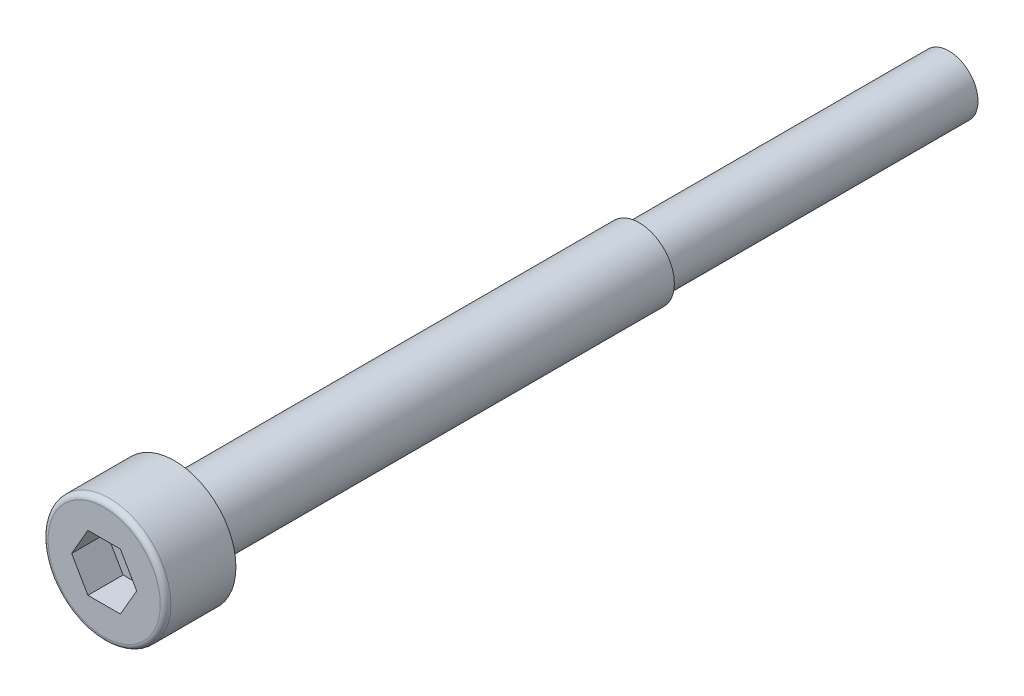
ISO-10303-21;
HEADER;
FILE_DESCRIPTION(('STEP AP214'),'2;1');
FILE_NAME('part.step','',(''),(''),'','','');
FILE_SCHEMA(('AUTOMOTIVE_DESIGN { 1 0 10303 214 1 1 1 1 }'));
ENDSEC;
DATA;
#1=APPLICATION_CONTEXT('core data for automotive mechanical design processes');
#2=APPLICATION_PROTOCOL_DEFINITION('international standard','automotive_design',2000,#1);
#3=PRODUCT_CONTEXT('',#1,'mechanical');
#4=PRODUCT('Part','Part','',(#3));
#5=PRODUCT_RELATED_PRODUCT_CATEGORY('part','',(#4));
#6=PRODUCT_DEFINITION_FORMATION('','',#4);
#7=PRODUCT_DEFINITION_CONTEXT('part definition',#1,'design');
#8=PRODUCT_DEFINITION('design','',#6,#7);
#9=PRODUCT_DEFINITION_SHAPE('','',#8);
#10=(LENGTH_UNIT() NAMED_UNIT(*) SI_UNIT(.MILLI.,.METRE.));
#11=(NAMED_UNIT(*) PLANE_ANGLE_UNIT() SI_UNIT($,.RADIAN.));
#12=(NAMED_UNIT(*) SI_UNIT($,.STERADIAN.) SOLID_ANGLE_UNIT());
#13=UNCERTAINTY_MEASURE_WITH_UNIT(LENGTH_MEASURE(1.E-05),#10,'distance_accuracy_value','');
#14=(GEOMETRIC_REPRESENTATION_CONTEXT(3) GLOBAL_UNCERTAINTY_ASSIGNED_CONTEXT((#13)) GLOBAL_UNIT_ASSIGNED_CONTEXT((#10,
#11,#12)) REPRESENTATION_CONTEXT('',''));
#15=CARTESIAN_POINT('',(0.,0.,0.));
#16=DIRECTION('',(0.,0.,1.));
#17=DIRECTION('',(1.,0.,0.));
#18=AXIS2_PLACEMENT_3D('',#15,#16,#17);
#19=CARTESIAN_POINT('',(2.309401076759,0.,2.5));
#20=DIRECTION('',(0.,0.,-1.));
#21=DIRECTION('',(0.,-1.,0.));
#22=AXIS2_PLACEMENT_3D('',#19,#20,#21);
#23=PLANE('',#22);
#24=DIRECTION('',(-0.50000000000019,0.866025403784329,0.));
#25=VECTOR('',#24,1.);
#26=CARTESIAN_POINT('',(2.309401076759,0.,2.5));
#27=LINE('',#26,#25);
#28=CARTESIAN_POINT('',(2.309401076759,0.,2.5));
#29=VERTEX_POINT('',#28);
#30=CARTESIAN_POINT('',(1.154700538379,2.,2.5));
#31=VERTEX_POINT('',#30);
#32=EDGE_CURVE('E11',#29,#31,#27,.T.);
#33=ORIENTED_EDGE('',*,*,#32,.T.);
#34=DIRECTION('',(-1.,0.,0.));
#35=VECTOR('',#34,1.);
#36=CARTESIAN_POINT('',(1.154700538379,2.,2.5));
#37=LINE('',#36,#35);
#38=CARTESIAN_POINT('',(-1.154700538379,2.,2.5));
#39=VERTEX_POINT('',#38);
#40=EDGE_CURVE('E42',#31,#39,#37,.T.);
#41=ORIENTED_EDGE('',*,*,#40,.T.);
#42=DIRECTION('',(-0.50000000000019,-0.866025403784329,0.));
#43=VECTOR('',#42,1.);
#44=CARTESIAN_POINT('',(-1.154700538379,2.,2.5));
#45=LINE('',#44,#43);
#46=CARTESIAN_POINT('',(-2.309401076759,0.,2.5));
#47=VERTEX_POINT('',#46);
#48=EDGE_CURVE('E203',#39,#47,#45,.T.);
#49=ORIENTED_EDGE('',*,*,#48,.T.);
#50=DIRECTION('',(0.50000000000019,-0.866025403784329,0.));
#51=VECTOR('',#50,1.);
#52=CARTESIAN_POINT('',(-2.309401076759,0.,2.5));
#53=LINE('',#52,#51);
#54=CARTESIAN_POINT('',(-1.154700538379,-2.,2.5));
#55=VERTEX_POINT('',#54);
#56=EDGE_CURVE('E193',#47,#55,#53,.T.);
#57=ORIENTED_EDGE('',*,*,#56,.T.);
#58=DIRECTION('',(1.,0.,0.));
#59=VECTOR('',#58,1.);
#60=CARTESIAN_POINT('',(-1.154700538379,-2.,2.5));
#61=LINE('',#60,#59);
#62=CARTESIAN_POINT('',(1.154700538379,-2.,2.5));
#63=VERTEX_POINT('',#62);
#64=EDGE_CURVE('E183',#55,#63,#61,.T.);
#65=ORIENTED_EDGE('',*,*,#64,.T.);
#66=DIRECTION('',(0.50000000000019,0.866025403784329,0.));
#67=VECTOR('',#66,1.);
#68=CARTESIAN_POINT('',(1.154700538379,-2.,2.5));
#69=LINE('',#68,#67);
#70=EDGE_CURVE('E171',#63,#29,#69,.T.);
#71=ORIENTED_EDGE('',*,*,#70,.T.);
#72=EDGE_LOOP('',(#33,#41,#49,#57,#65,#71));
#73=FACE_BOUND('',#72,.T.);
#74=ADVANCED_FACE('F16',(#73),#23,.F.);
#75=CARTESIAN_POINT('',(0.,0.,-55.));
#76=DIRECTION('',(0.,0.,1.));
#77=DIRECTION('',(1.,0.,0.));
#78=AXIS2_PLACEMENT_3D('',#75,#76,#77);
#79=PLANE('',#78);
#80=CARTESIAN_POINT('',(0.,0.,-55.));
#81=DIRECTION('',(0.,0.,1.));
#82=DIRECTION('',(1.,0.,0.));
#83=AXIS2_PLACEMENT_3D('',#80,#81,#82);
#84=CIRCLE('',#83,2.066987298108);
#85=CARTESIAN_POINT('',(2.066987298108,0.,-55.));
#86=VERTEX_POINT('',#85);
#87=EDGE_CURVE('E162',#86,#86,#84,.T.);
#88=ORIENTED_EDGE('',*,*,#87,.F.);
#89=EDGE_LOOP('',(#88));
#90=FACE_BOUND('',#89,.T.);
#91=ADVANCED_FACE('F18',(#90),#79,.F.);
#92=CARTESIAN_POINT('',(2.309401076759,0.,2.5));
#93=DIRECTION('',(-0.866025403784329,-0.50000000000019,0.));
#94=DIRECTION('',(-0.50000000000019,0.866025403784329,0.));
#95=AXIS2_PLACEMENT_3D('',#92,#93,#94);
#96=PLANE('',#95);
#97=DIRECTION('',(-0.50000000000019,0.866025403784329,0.));
#98=VECTOR('',#97,1.);
#99=CARTESIAN_POINT('',(2.309401076759,0.,5.));
#100=LINE('',#99,#98);
#101=CARTESIAN_POINT('',(2.309401076759,0.,5.));
#102=VERTEX_POINT('',#101);
#103=CARTESIAN_POINT('',(1.154700538379,2.,5.));
#104=VERTEX_POINT('',#103);
#105=EDGE_CURVE('E141',#102,#104,#100,.T.);
#106=ORIENTED_EDGE('',*,*,#105,.T.);
#107=CARTESIAN_POINT('',(1.154700538379,2.,5.));
#108=CARTESIAN_POINT('',(1.154700538379,2.,2.5));
#109=(BOUNDED_CURVE() B_SPLINE_CURVE(1,(#107,#108),.UNSPECIFIED.,.F.,
.F.) B_SPLINE_CURVE_WITH_KNOTS((2,2),(0.,1.),
.UNSPECIFIED.) CURVE() GEOMETRIC_REPRESENTATION_ITEM() RATIONAL_B_SPLINE_CURVE((1.,1.)) REPRESENTATION_ITEM(''));
#110=EDGE_CURVE('E25',#104,#31,#109,.T.);
#111=ORIENTED_EDGE('',*,*,#110,.T.);
#112=ORIENTED_EDGE('',*,*,#32,.F.);
#113=CARTESIAN_POINT('',(2.309401076759,0.,5.));
#114=CARTESIAN_POINT('',(2.309401076759,0.,2.5));
#115=(BOUNDED_CURVE() B_SPLINE_CURVE(1,(#113,#114),.UNSPECIFIED.,.F.,
.F.) B_SPLINE_CURVE_WITH_KNOTS((2,2),(0.,1.),
.UNSPECIFIED.) CURVE() GEOMETRIC_REPRESENTATION_ITEM() RATIONAL_B_SPLINE_CURVE((1.,1.)) REPRESENTATION_ITEM(''));
#116=EDGE_CURVE('E165',#102,#29,#115,.T.);
#117=ORIENTED_EDGE('',*,*,#116,.F.);
#118=EDGE_LOOP('',(#106,#111,#112,#117));
#119=FACE_BOUND('',#118,.T.);
#120=ADVANCED_FACE('F216',(#119),#96,.T.);
#121=CARTESIAN_POINT('',(1.154700538379,2.,2.5));
#122=DIRECTION('',(0.,-1.,0.));
#123=DIRECTION('',(-1.,0.,0.));
#124=AXIS2_PLACEMENT_3D('',#121,#122,#123);
#125=PLANE('',#124);
#126=DIRECTION('',(-1.,0.,0.));
#127=VECTOR('',#126,1.);
#128=CARTESIAN_POINT('',(1.154700538379,2.,5.));
#129=LINE('',#128,#127);
#130=CARTESIAN_POINT('',(-1.154700538379,2.,5.));
#131=VERTEX_POINT('',#130);
#132=EDGE_CURVE('E151',#104,#131,#129,.T.);
#133=ORIENTED_EDGE('',*,*,#132,.T.);
#134=CARTESIAN_POINT('',(-1.154700538379,2.,5.));
#135=CARTESIAN_POINT('',(-1.154700538379,2.,2.5));
#136=(BOUNDED_CURVE() B_SPLINE_CURVE(1,(#134,#135),.UNSPECIFIED.,.F.,
.F.) B_SPLINE_CURVE_WITH_KNOTS((2,2),(0.,1.),
.UNSPECIFIED.) CURVE() GEOMETRIC_REPRESENTATION_ITEM() RATIONAL_B_SPLINE_CURVE((1.,1.)) REPRESENTATION_ITEM(''));
#137=EDGE_CURVE('E158',#131,#39,#136,.T.);
#138=ORIENTED_EDGE('',*,*,#137,.T.);
#139=ORIENTED_EDGE('',*,*,#40,.F.);
#140=ORIENTED_EDGE('',*,*,#110,.F.);
#141=EDGE_LOOP('',(#133,#138,#139,#140));
#142=FACE_BOUND('',#141,.T.);
#143=ADVANCED_FACE('F221',(#142),#125,.T.);
#144=CARTESIAN_POINT('',(-1.154700538379,2.,2.5));
#145=DIRECTION('',(0.866025403784329,-0.50000000000019,0.));
#146=DIRECTION('',(0.,0.,-1.));
#147=AXIS2_PLACEMENT_3D('',#144,#145,#146);
#148=PLANE('',#147);
#149=DIRECTION('',(-0.50000000000019,-0.866025403784329,0.));
#150=VECTOR('',#149,1.);
#151=CARTESIAN_POINT('',(-1.154700538379,2.,5.));
#152=LINE('',#151,#150);
#153=CARTESIAN_POINT('',(-2.309401076759,0.,5.));
#154=VERTEX_POINT('',#153);
#155=EDGE_CURVE('E155',#131,#154,#152,.T.);
#156=ORIENTED_EDGE('',*,*,#155,.T.);
#157=CARTESIAN_POINT('',(-2.309401076759,0.,5.));
#158=CARTESIAN_POINT('',(-2.309401076759,0.,2.5));
#159=(BOUNDED_CURVE() B_SPLINE_CURVE(1,(#157,#158),.UNSPECIFIED.,.F.,
.F.) B_SPLINE_CURVE_WITH_KNOTS((2,2),(0.,1.),
.UNSPECIFIED.) CURVE() GEOMETRIC_REPRESENTATION_ITEM() RATIONAL_B_SPLINE_CURVE((1.,1.)) REPRESENTATION_ITEM(''));
#160=EDGE_CURVE('E194',#154,#47,#159,.T.);
#161=ORIENTED_EDGE('',*,*,#160,.T.);
#162=ORIENTED_EDGE('',*,*,#48,.F.);
#163=ORIENTED_EDGE('',*,*,#137,.F.);
#164=EDGE_LOOP('',(#156,#161,#162,#163));
#165=FACE_BOUND('',#164,.T.);
#166=ADVANCED_FACE('F226',(#165),#148,.T.);
#167=CARTESIAN_POINT('',(-2.309401076759,0.,2.5));
#168=DIRECTION('',(0.866025403784329,0.50000000000019,0.));
#169=DIRECTION('',(0.,0.,-1.));
#170=AXIS2_PLACEMENT_3D('',#167,#168,#169);
#171=PLANE('',#170);
#172=DIRECTION('',(0.50000000000019,-0.866025403784329,0.));
#173=VECTOR('',#172,1.);
#174=CARTESIAN_POINT('',(-2.309401076759,0.,5.));
#175=LINE('',#174,#173);
#176=CARTESIAN_POINT('',(-1.154700538379,-2.,5.));
#177=VERTEX_POINT('',#176);
#178=EDGE_CURVE('E147',#154,#177,#175,.T.);
#179=ORIENTED_EDGE('',*,*,#178,.T.);
#180=CARTESIAN_POINT('',(-1.154700538379,-2.,5.));
#181=CARTESIAN_POINT('',(-1.154700538379,-2.,2.5));
#182=(BOUNDED_CURVE() B_SPLINE_CURVE(1,(#180,#181),.UNSPECIFIED.,.F.,
.F.) B_SPLINE_CURVE_WITH_KNOTS((2,2),(0.,1.),
.UNSPECIFIED.) CURVE() GEOMETRIC_REPRESENTATION_ITEM() RATIONAL_B_SPLINE_CURVE((1.,1.)) REPRESENTATION_ITEM(''));
#183=EDGE_CURVE('E184',#177,#55,#182,.T.);
#184=ORIENTED_EDGE('',*,*,#183,.T.);
#185=ORIENTED_EDGE('',*,*,#56,.F.);
#186=ORIENTED_EDGE('',*,*,#160,.F.);
#187=EDGE_LOOP('',(#179,#184,#185,#186));
#188=FACE_BOUND('',#187,.T.);
#189=ADVANCED_FACE('F232',(#188),#171,.T.);
#190=CARTESIAN_POINT('',(-1.154700538379,-2.,2.5));
#191=DIRECTION('',(0.,1.,0.));
#192=DIRECTION('',(1.,0.,0.));
#193=AXIS2_PLACEMENT_3D('',#190,#191,#192);
#194=PLANE('',#193);
#195=DIRECTION('',(1.,0.,0.));
#196=VECTOR('',#195,1.);
#197=CARTESIAN_POINT('',(-1.154700538379,-2.,5.));
#198=LINE('',#197,#196);
#199=CARTESIAN_POINT('',(1.154700538379,-2.,5.));
#200=VERTEX_POINT('',#199);
#201=EDGE_CURVE('E135',#177,#200,#198,.T.);
#202=ORIENTED_EDGE('',*,*,#201,.T.);
#203=CARTESIAN_POINT('',(1.154700538379,-2.,5.));
#204=CARTESIAN_POINT('',(1.154700538379,-2.,2.5));
#205=(BOUNDED_CURVE() B_SPLINE_CURVE(1,(#203,#204),.UNSPECIFIED.,.F.,
.F.) B_SPLINE_CURVE_WITH_KNOTS((2,2),(0.,1.),
.UNSPECIFIED.) CURVE() GEOMETRIC_REPRESENTATION_ITEM() RATIONAL_B_SPLINE_CURVE((1.,1.)) REPRESENTATION_ITEM(''));
#206=EDGE_CURVE('E177',#200,#63,#205,.T.);
#207=ORIENTED_EDGE('',*,*,#206,.T.);
#208=ORIENTED_EDGE('',*,*,#64,.F.);
#209=ORIENTED_EDGE('',*,*,#183,.F.);
#210=EDGE_LOOP('',(#202,#207,#208,#209));
#211=FACE_BOUND('',#210,.T.);
#212=ADVANCED_FACE('F236',(#211),#194,.T.);
#213=CARTESIAN_POINT('',(1.154700538379,-2.,2.5));
#214=DIRECTION('',(-0.866025403784329,0.50000000000019,0.));
#215=DIRECTION('',(0.,0.,1.));
#216=AXIS2_PLACEMENT_3D('',#213,#214,#215);
#217=PLANE('',#216);
#218=DIRECTION('',(0.50000000000019,0.866025403784329,0.));
#219=VECTOR('',#218,1.);
#220=CARTESIAN_POINT('',(1.154700538379,-2.,5.));
#221=LINE('',#220,#219);
#222=EDGE_CURVE('E136',#200,#102,#221,.T.);
#223=ORIENTED_EDGE('',*,*,#222,.T.);
#224=ORIENTED_EDGE('',*,*,#116,.T.);
#225=ORIENTED_EDGE('',*,*,#70,.F.);
#226=ORIENTED_EDGE('',*,*,#206,.F.);
#227=EDGE_LOOP('',(#223,#224,#225,#226));
#228=FACE_BOUND('',#227,.T.);
#229=ADVANCED_FACE('F304',(#228),#217,.T.);
#230=CARTESIAN_POINT('',(0.,0.,-55.));
#231=DIRECTION('',(0.,0.,1.));
#232=DIRECTION('',(1.,0.,0.));
#233=AXIS2_PLACEMENT_3D('',#230,#231,#232);
#234=CYLINDRICAL_SURFACE('',#233,2.066987298108);
#235=CARTESIAN_POINT('',(0.,0.,-33.));
#236=DIRECTION('',(0.,0.,1.));
#237=DIRECTION('',(1.,0.,0.));
#238=AXIS2_PLACEMENT_3D('',#235,#236,#237);
#239=CIRCLE('',#238,2.066987298108);
#240=CARTESIAN_POINT('',(2.066987298108,0.,-33.));
#241=VERTEX_POINT('',#240);
#242=EDGE_CURVE('E131',#241,#241,#239,.T.);
#243=ORIENTED_EDGE('',*,*,#242,.F.);
#244=DIRECTION('',(0.,0.,1.));
#245=VECTOR('',#244,1.);
#246=CARTESIAN_POINT('',(2.066987298108,0.,-55.));
#247=LINE('',#246,#245);
#248=EDGE_CURVE('E140',#86,#241,#247,.T.);
#249=ORIENTED_EDGE('',*,*,#248,.F.);
#250=ORIENTED_EDGE('',*,*,#87,.T.);
#251=ORIENTED_EDGE('',*,*,#248,.T.);
#252=EDGE_LOOP('',(#243,#249,#250,#251));
#253=FACE_BOUND('',#252,.T.);
#254=ADVANCED_FACE('F274',(#253),#234,.T.);
#255=CARTESIAN_POINT('',(0.,0.,5.));
#256=DIRECTION('',(0.,0.,1.));
#257=DIRECTION('',(1.,0.,0.));
#258=AXIS2_PLACEMENT_3D('',#255,#256,#257);
#259=PLANE('',#258);
#260=ORIENTED_EDGE('',*,*,#201,.F.);
#261=ORIENTED_EDGE('',*,*,#178,.F.);
#262=ORIENTED_EDGE('',*,*,#155,.F.);
#263=ORIENTED_EDGE('',*,*,#132,.F.);
#264=ORIENTED_EDGE('',*,*,#105,.F.);
#265=ORIENTED_EDGE('',*,*,#222,.F.);
#266=EDGE_LOOP('',(#260,#261,#262,#263,#264,#265));
#267=FACE_BOUND('',#266,.T.);
#268=CARTESIAN_POINT('',(0.,0.,5.));
#269=DIRECTION('',(0.,0.,1.));
#270=DIRECTION('',(1.,0.,0.));
#271=AXIS2_PLACEMENT_3D('',#268,#269,#270);
#272=CIRCLE('',#271,3.985);
#273=CARTESIAN_POINT('',(3.985,0.,5.));
#274=VERTEX_POINT('',#273);
#275=EDGE_CURVE('E125',#274,#274,#272,.T.);
#276=ORIENTED_EDGE('',*,*,#275,.T.);
#277=EDGE_LOOP('',(#276));
#278=FACE_BOUND('',#277,.T.);
#279=ADVANCED_FACE('F281',(#267,#278),#259,.T.);
#280=CARTESIAN_POINT('',(0.,0.,-33.));
#281=DIRECTION('',(0.,0.,1.));
#282=DIRECTION('',(1.,0.,0.));
#283=AXIS2_PLACEMENT_3D('',#280,#281,#282);
#284=PLANE('',#283);
#285=ORIENTED_EDGE('',*,*,#242,.T.);
#286=EDGE_LOOP('',(#285));
#287=FACE_BOUND('',#286,.T.);
#288=CARTESIAN_POINT('',(0.,0.,-33.));
#289=DIRECTION('',(0.,0.,1.));
#290=DIRECTION('',(1.,0.,0.));
#291=AXIS2_PLACEMENT_3D('',#288,#289,#290);
#292=CIRCLE('',#291,2.5);
#293=CARTESIAN_POINT('',(2.5,0.,-33.));
#294=VERTEX_POINT('',#293);
#295=EDGE_CURVE('E116',#294,#294,#292,.T.);
#296=ORIENTED_EDGE('',*,*,#295,.F.);
#297=EDGE_LOOP('',(#296));
#298=FACE_BOUND('',#297,.T.);
#299=ADVANCED_FACE('F277',(#287,#298),#284,.F.);
#300=CARTESIAN_POINT('',(0.,0.,4.625));
#301=DIRECTION('',(0.,0.,-1.));
#302=DIRECTION('',(1.,0.,0.));
#303=AXIS2_PLACEMENT_3D('',#300,#301,#302);
#304=TOROIDAL_SURFACE('',#303,3.985,0.375);
#305=CARTESIAN_POINT('',(3.985,0.,4.625));
#306=DIRECTION('',(0.,1.,0.));
#307=DIRECTION('',(-1.,0.,0.));
#308=AXIS2_PLACEMENT_3D('',#305,#306,#307);
#309=CIRCLE('',#308,0.375);
#310=CARTESIAN_POINT('',(4.36,0.,4.625));
#311=VERTEX_POINT('',#310);
#312=EDGE_CURVE('E120',#274,#311,#309,.T.);
#313=ORIENTED_EDGE('',*,*,#312,.T.);
#314=CARTESIAN_POINT('',(0.,0.,4.625));
#315=DIRECTION('',(0.,0.,1.));
#316=DIRECTION('',(1.,0.,0.));
#317=AXIS2_PLACEMENT_3D('',#314,#315,#316);
#318=CIRCLE('',#317,4.36);
#319=EDGE_CURVE('E127',#311,#311,#318,.T.);
#320=ORIENTED_EDGE('',*,*,#319,.T.);
#321=ORIENTED_EDGE('',*,*,#312,.F.);
#322=ORIENTED_EDGE('',*,*,#275,.F.);
#323=EDGE_LOOP('',(#313,#320,#321,#322));
#324=FACE_BOUND('',#323,.T.);
#325=ADVANCED_FACE('F280',(#324),#304,.T.);
#326=CARTESIAN_POINT('',(0.,0.,-16.5));
#327=DIRECTION('',(0.,0.,1.));
#328=DIRECTION('',(1.,0.,0.));
#329=AXIS2_PLACEMENT_3D('',#326,#327,#328);
#330=CYLINDRICAL_SURFACE('',#329,2.5);
#331=ORIENTED_EDGE('',*,*,#295,.T.);
#332=DIRECTION('',(0.,0.,1.));
#333=VECTOR('',#332,1.);
#334=CARTESIAN_POINT('',(2.5,0.,-16.5));
#335=LINE('',#334,#333);
#336=CARTESIAN_POINT('',(2.5,0.,0.));
#337=VERTEX_POINT('',#336);
#338=EDGE_CURVE('E113',#294,#337,#335,.T.);
#339=ORIENTED_EDGE('',*,*,#338,.T.);
#340=CARTESIAN_POINT('',(0.,0.,0.));
#341=DIRECTION('',(0.,0.,1.));
#342=DIRECTION('',(1.,0.,0.));
#343=AXIS2_PLACEMENT_3D('',#340,#341,#342);
#344=CIRCLE('',#343,2.5);
#345=EDGE_CURVE('E118',#337,#337,#344,.T.);
#346=ORIENTED_EDGE('',*,*,#345,.F.);
#347=ORIENTED_EDGE('',*,*,#338,.F.);
#348=EDGE_LOOP('',(#331,#339,#346,#347));
#349=FACE_BOUND('',#348,.T.);
#350=ADVANCED_FACE('F114',(#349),#330,.T.);
#351=CARTESIAN_POINT('',(0.,0.,2.5));
#352=DIRECTION('',(0.,0.,1.));
#353=DIRECTION('',(1.,0.,0.));
#354=AXIS2_PLACEMENT_3D('',#351,#352,#353);
#355=CYLINDRICAL_SURFACE('',#354,4.36);
#356=CARTESIAN_POINT('',(0.,0.,0.));
#357=DIRECTION('',(0.,0.,1.));
#358=DIRECTION('',(1.,0.,0.));
#359=AXIS2_PLACEMENT_3D('',#356,#357,#358);
#360=CIRCLE('',#359,4.36);
#361=CARTESIAN_POINT('',(4.36,0.,0.));
#362=VERTEX_POINT('',#361);
#363=EDGE_CURVE('E263',#362,#362,#360,.T.);
#364=ORIENTED_EDGE('',*,*,#363,.T.);
#365=DIRECTION('',(0.,0.,1.));
#366=VECTOR('',#365,1.);
#367=CARTESIAN_POINT('',(4.36,0.,2.5));
#368=LINE('',#367,#366);
#369=EDGE_CURVE('E245',#362,#311,#368,.T.);
#370=ORIENTED_EDGE('',*,*,#369,.T.);
#371=ORIENTED_EDGE('',*,*,#319,.F.);
#372=ORIENTED_EDGE('',*,*,#369,.F.);
#373=EDGE_LOOP('',(#364,#370,#371,#372));
#374=FACE_BOUND('',#373,.T.);
#375=ADVANCED_FACE('F301',(#374),#355,.T.);
#376=CARTESIAN_POINT('',(0.,0.,0.));
#377=DIRECTION('',(0.,0.,1.));
#378=DIRECTION('',(1.,0.,0.));
#379=AXIS2_PLACEMENT_3D('',#376,#377,#378);
#380=PLANE('',#379);
#381=ORIENTED_EDGE('',*,*,#345,.T.);
#382=EDGE_LOOP('',(#381));
#383=FACE_BOUND('',#382,.T.);
#384=ORIENTED_EDGE('',*,*,#363,.F.);
#385=EDGE_LOOP('',(#384));
#386=FACE_BOUND('',#385,.T.);
#387=ADVANCED_FACE('F307',(#383,#386),#380,.F.);
#388=CLOSED_SHELL('',(#74,#91,#120,#143,#166,#189,#212,#229,#254,#279,#299,#325,#350,#375,#387));
#389=MANIFOLD_SOLID_BREP('B1',#388);
#390=ADVANCED_BREP_SHAPE_REPRESENTATION('',(#18,#389),#14);
#391=SHAPE_DEFINITION_REPRESENTATION(#9,#390);
ENDSEC;
END-ISO-10303-21;
